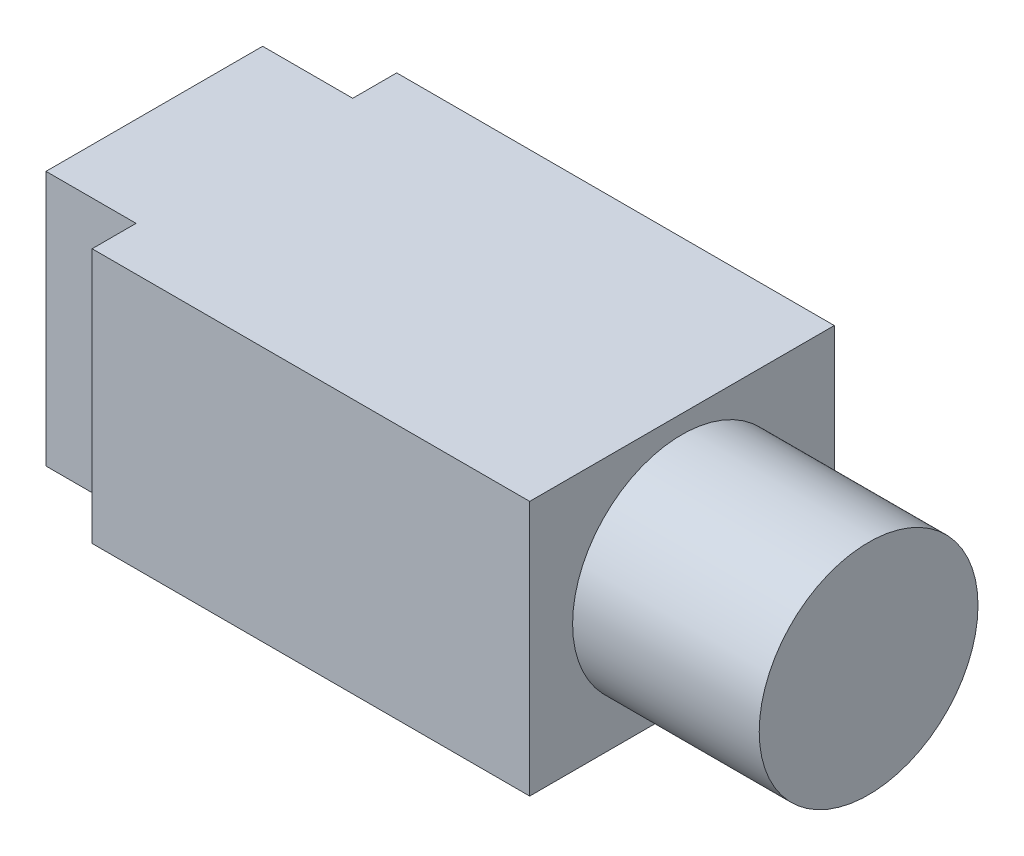
ISO-10303-21;
HEADER;
FILE_DESCRIPTION(('STEP AP214'),'2;1');
FILE_NAME('part.step','',(''),(''),'','','');
FILE_SCHEMA(('AUTOMOTIVE_DESIGN { 1 0 10303 214 1 1 1 1 }'));
ENDSEC;
DATA;
#1=APPLICATION_CONTEXT('core data for automotive mechanical design processes');
#2=APPLICATION_PROTOCOL_DEFINITION('international standard','automotive_design',2000,#1);
#3=PRODUCT_CONTEXT('',#1,'mechanical');
#4=PRODUCT('Part','Part','',(#3));
#5=PRODUCT_RELATED_PRODUCT_CATEGORY('part','',(#4));
#6=PRODUCT_DEFINITION_FORMATION('','',#4);
#7=PRODUCT_DEFINITION_CONTEXT('part definition',#1,'design');
#8=PRODUCT_DEFINITION('design','',#6,#7);
#9=PRODUCT_DEFINITION_SHAPE('','',#8);
#10=(LENGTH_UNIT() NAMED_UNIT(*) SI_UNIT(.MILLI.,.METRE.));
#11=(NAMED_UNIT(*) PLANE_ANGLE_UNIT() SI_UNIT($,.RADIAN.));
#12=(NAMED_UNIT(*) SI_UNIT($,.STERADIAN.) SOLID_ANGLE_UNIT());
#13=UNCERTAINTY_MEASURE_WITH_UNIT(LENGTH_MEASURE(1.E-05),#10,'distance_accuracy_value','');
#14=(GEOMETRIC_REPRESENTATION_CONTEXT(3) GLOBAL_UNCERTAINTY_ASSIGNED_CONTEXT((#13)) GLOBAL_UNIT_ASSIGNED_CONTEXT((#10,
#11,#12)) REPRESENTATION_CONTEXT('',''));
#15=CARTESIAN_POINT('',(0.,0.,0.));
#16=DIRECTION('',(0.,0.,1.));
#17=DIRECTION('',(1.,0.,0.));
#18=AXIS2_PLACEMENT_3D('',#15,#16,#17);
#19=CARTESIAN_POINT('',(0.,5.95,-5.05));
#20=DIRECTION('',(0.,0.,1.));
#21=DIRECTION('',(1.,0.,0.));
#22=AXIS2_PLACEMENT_3D('',#19,#20,#21);
#23=PLANE('',#22);
#24=DIRECTION('',(-1.,0.,0.));
#25=VECTOR('',#24,1.);
#26=CARTESIAN_POINT('',(0.,-5.95,-5.05));
#27=LINE('',#26,#25);
#28=CARTESIAN_POINT('',(-10.2,-5.95,-5.05));
#29=VERTEX_POINT('',#28);
#30=CARTESIAN_POINT('',(-14.4,-5.95,-5.05));
#31=VERTEX_POINT('',#30);
#32=EDGE_CURVE('E151',#29,#31,#27,.T.);
#33=ORIENTED_EDGE('',*,*,#32,.T.);
#34=DIRECTION('',(0.,-1.,0.));
#35=VECTOR('',#34,1.);
#36=CARTESIAN_POINT('',(-14.4,5.95,-5.05));
#37=LINE('',#36,#35);
#38=CARTESIAN_POINT('',(-14.4,5.95,-5.05));
#39=VERTEX_POINT('',#38);
#40=EDGE_CURVE('E48',#39,#31,#37,.T.);
#41=ORIENTED_EDGE('',*,*,#40,.F.);
#42=DIRECTION('',(-1.,0.,0.));
#43=VECTOR('',#42,1.);
#44=CARTESIAN_POINT('',(0.,5.95,-5.05));
#45=LINE('',#44,#43);
#46=CARTESIAN_POINT('',(-10.2,5.95,-5.05));
#47=VERTEX_POINT('',#46);
#48=EDGE_CURVE('E200',#47,#39,#45,.T.);
#49=ORIENTED_EDGE('',*,*,#48,.F.);
#50=DIRECTION('',(0.,-1.,0.));
#51=VECTOR('',#50,1.);
#52=CARTESIAN_POINT('',(-10.2,5.95,-5.05));
#53=LINE('',#52,#51);
#54=EDGE_CURVE('E63',#47,#29,#53,.T.);
#55=ORIENTED_EDGE('',*,*,#54,.T.);
#56=EDGE_LOOP('',(#33,#41,#49,#55));
#57=FACE_BOUND('',#56,.T.);
#58=ADVANCED_FACE('F45',(#57),#23,.F.);
#59=CARTESIAN_POINT('',(-14.4,5.95,0.));
#60=DIRECTION('',(1.,0.,0.));
#61=DIRECTION('',(0.,0.,-1.));
#62=AXIS2_PLACEMENT_3D('',#59,#60,#61);
#63=PLANE('',#62);
#64=DIRECTION('',(0.,0.,1.));
#65=VECTOR('',#64,1.);
#66=CARTESIAN_POINT('',(-14.4,-5.95,0.));
#67=LINE('',#66,#65);
#68=CARTESIAN_POINT('',(-14.4,-5.95,5.05));
#69=VERTEX_POINT('',#68);
#70=EDGE_CURVE('E154',#31,#69,#67,.T.);
#71=ORIENTED_EDGE('',*,*,#70,.T.);
#72=DIRECTION('',(0.,-1.,0.));
#73=VECTOR('',#72,1.);
#74=CARTESIAN_POINT('',(-14.4,5.95,5.05));
#75=LINE('',#74,#73);
#76=CARTESIAN_POINT('',(-14.4,5.95,5.05));
#77=VERTEX_POINT('',#76);
#78=EDGE_CURVE('E187',#77,#69,#75,.T.);
#79=ORIENTED_EDGE('',*,*,#78,.F.);
#80=DIRECTION('',(0.,0.,1.));
#81=VECTOR('',#80,1.);
#82=CARTESIAN_POINT('',(-14.4,5.95,0.));
#83=LINE('',#82,#81);
#84=EDGE_CURVE('E102',#39,#77,#83,.T.);
#85=ORIENTED_EDGE('',*,*,#84,.F.);
#86=ORIENTED_EDGE('',*,*,#40,.T.);
#87=EDGE_LOOP('',(#71,#79,#85,#86));
#88=FACE_BOUND('',#87,.T.);
#89=ADVANCED_FACE('F194',(#88),#63,.F.);
#90=CARTESIAN_POINT('',(0.,5.95,5.05));
#91=DIRECTION('',(0.,0.,1.));
#92=DIRECTION('',(1.,0.,0.));
#93=AXIS2_PLACEMENT_3D('',#90,#91,#92);
#94=PLANE('',#93);
#95=DIRECTION('',(-1.,0.,0.));
#96=VECTOR('',#95,1.);
#97=CARTESIAN_POINT('',(0.,-5.95,5.05));
#98=LINE('',#97,#96);
#99=CARTESIAN_POINT('',(-10.2,-5.95,5.05));
#100=VERTEX_POINT('',#99);
#101=EDGE_CURVE('E159',#100,#69,#98,.T.);
#102=ORIENTED_EDGE('',*,*,#101,.F.);
#103=DIRECTION('',(0.,-1.,0.));
#104=VECTOR('',#103,1.);
#105=CARTESIAN_POINT('',(-10.2,5.95,5.05));
#106=LINE('',#105,#104);
#107=CARTESIAN_POINT('',(-10.2,5.95,5.05));
#108=VERTEX_POINT('',#107);
#109=EDGE_CURVE('E185',#108,#100,#106,.T.);
#110=ORIENTED_EDGE('',*,*,#109,.F.);
#111=DIRECTION('',(-1.,0.,0.));
#112=VECTOR('',#111,1.);
#113=CARTESIAN_POINT('',(0.,5.95,5.05));
#114=LINE('',#113,#112);
#115=EDGE_CURVE('E204',#108,#77,#114,.T.);
#116=ORIENTED_EDGE('',*,*,#115,.T.);
#117=ORIENTED_EDGE('',*,*,#78,.T.);
#118=EDGE_LOOP('',(#102,#110,#116,#117));
#119=FACE_BOUND('',#118,.T.);
#120=ADVANCED_FACE('F216',(#119),#94,.T.);
#121=CARTESIAN_POINT('',(-10.2,5.95,0.));
#122=DIRECTION('',(-1.,0.,0.));
#123=DIRECTION('',(0.,0.,1.));
#124=AXIS2_PLACEMENT_3D('',#121,#122,#123);
#125=PLANE('',#124);
#126=DIRECTION('',(0.,0.,-1.));
#127=VECTOR('',#126,1.);
#128=CARTESIAN_POINT('',(-10.2,-5.95,0.));
#129=LINE('',#128,#127);
#130=CARTESIAN_POINT('',(-10.2,-5.95,7.1));
#131=VERTEX_POINT('',#130);
#132=EDGE_CURVE('E163',#131,#100,#129,.T.);
#133=ORIENTED_EDGE('',*,*,#132,.F.);
#134=DIRECTION('',(0.,-1.,0.));
#135=VECTOR('',#134,1.);
#136=CARTESIAN_POINT('',(-10.2,5.95,7.1));
#137=LINE('',#136,#135);
#138=CARTESIAN_POINT('',(-10.2,5.95,7.1));
#139=VERTEX_POINT('',#138);
#140=EDGE_CURVE('E182',#139,#131,#137,.T.);
#141=ORIENTED_EDGE('',*,*,#140,.F.);
#142=DIRECTION('',(0.,0.,-1.));
#143=VECTOR('',#142,1.);
#144=CARTESIAN_POINT('',(-10.2,5.95,0.));
#145=LINE('',#144,#143);
#146=EDGE_CURVE('E148',#139,#108,#145,.T.);
#147=ORIENTED_EDGE('',*,*,#146,.T.);
#148=ORIENTED_EDGE('',*,*,#109,.T.);
#149=EDGE_LOOP('',(#133,#141,#147,#148));
#150=FACE_BOUND('',#149,.T.);
#151=ADVANCED_FACE('F214',(#150),#125,.T.);
#152=CARTESIAN_POINT('',(0.,5.95,7.1));
#153=DIRECTION('',(0.,0.,-1.));
#154=DIRECTION('',(-1.,0.,0.));
#155=AXIS2_PLACEMENT_3D('',#152,#153,#154);
#156=PLANE('',#155);
#157=DIRECTION('',(1.,0.,0.));
#158=VECTOR('',#157,1.);
#159=CARTESIAN_POINT('',(0.,-5.95,7.1));
#160=LINE('',#159,#158);
#161=CARTESIAN_POINT('',(10.2,-5.95,7.1));
#162=VERTEX_POINT('',#161);
#163=EDGE_CURVE('E167',#131,#162,#160,.T.);
#164=ORIENTED_EDGE('',*,*,#163,.T.);
#165=DIRECTION('',(0.,-1.,0.));
#166=VECTOR('',#165,1.);
#167=CARTESIAN_POINT('',(10.2,5.95,7.1));
#168=LINE('',#167,#166);
#169=CARTESIAN_POINT('',(10.2,5.95,7.1));
#170=VERTEX_POINT('',#169);
#171=EDGE_CURVE('E140',#170,#162,#168,.T.);
#172=ORIENTED_EDGE('',*,*,#171,.F.);
#173=DIRECTION('',(1.,0.,0.));
#174=VECTOR('',#173,1.);
#175=CARTESIAN_POINT('',(0.,5.95,7.1));
#176=LINE('',#175,#174);
#177=EDGE_CURVE('E126',#139,#170,#176,.T.);
#178=ORIENTED_EDGE('',*,*,#177,.F.);
#179=ORIENTED_EDGE('',*,*,#140,.T.);
#180=EDGE_LOOP('',(#164,#172,#178,#179));
#181=FACE_BOUND('',#180,.T.);
#182=ADVANCED_FACE('F219',(#181),#156,.F.);
#183=CARTESIAN_POINT('',(10.2,5.95,0.));
#184=DIRECTION('',(-1.,0.,0.));
#185=DIRECTION('',(0.,0.,1.));
#186=AXIS2_PLACEMENT_3D('',#183,#184,#185);
#187=PLANE('',#186);
#188=CARTESIAN_POINT('',(10.2,0.,0.));
#189=DIRECTION('',(1.,0.,0.));
#190=DIRECTION('',(0.,0.,-1.));
#191=AXIS2_PLACEMENT_3D('',#188,#189,#190);
#192=CIRCLE('',#191,5.1);
#193=CARTESIAN_POINT('',(10.2,0.,-5.1));
#194=VERTEX_POINT('',#193);
#195=EDGE_CURVE('E11',#194,#194,#192,.T.);
#196=ORIENTED_EDGE('',*,*,#195,.F.);
#197=EDGE_LOOP('',(#196));
#198=FACE_BOUND('',#197,.T.);
#199=DIRECTION('',(0.,0.,-1.));
#200=VECTOR('',#199,1.);
#201=CARTESIAN_POINT('',(10.2,-5.95,0.));
#202=LINE('',#201,#200);
#203=CARTESIAN_POINT('',(10.2,-5.95,-7.1));
#204=VERTEX_POINT('',#203);
#205=EDGE_CURVE('E136',#162,#204,#202,.T.);
#206=ORIENTED_EDGE('',*,*,#205,.T.);
#207=DIRECTION('',(0.,-1.,0.));
#208=VECTOR('',#207,1.);
#209=CARTESIAN_POINT('',(10.2,5.95,-7.1));
#210=LINE('',#209,#208);
#211=CARTESIAN_POINT('',(10.2,5.95,-7.1));
#212=VERTEX_POINT('',#211);
#213=EDGE_CURVE('E133',#212,#204,#210,.T.);
#214=ORIENTED_EDGE('',*,*,#213,.F.);
#215=DIRECTION('',(0.,0.,-1.));
#216=VECTOR('',#215,1.);
#217=CARTESIAN_POINT('',(10.2,5.95,0.));
#218=LINE('',#217,#216);
#219=EDGE_CURVE('E118',#170,#212,#218,.T.);
#220=ORIENTED_EDGE('',*,*,#219,.F.);
#221=ORIENTED_EDGE('',*,*,#171,.T.);
#222=EDGE_LOOP('',(#206,#214,#220,#221));
#223=FACE_BOUND('',#222,.T.);
#224=ADVANCED_FACE('F134',(#198,#223),#187,.F.);
#225=CARTESIAN_POINT('',(0.,5.95,-7.1));
#226=DIRECTION('',(0.,0.,-1.));
#227=DIRECTION('',(-1.,0.,0.));
#228=AXIS2_PLACEMENT_3D('',#225,#226,#227);
#229=PLANE('',#228);
#230=DIRECTION('',(1.,0.,0.));
#231=VECTOR('',#230,1.);
#232=CARTESIAN_POINT('',(0.,-5.95,-7.1));
#233=LINE('',#232,#231);
#234=CARTESIAN_POINT('',(-10.2,-5.95,-7.1));
#235=VERTEX_POINT('',#234);
#236=EDGE_CURVE('E173',#235,#204,#233,.T.);
#237=ORIENTED_EDGE('',*,*,#236,.F.);
#238=DIRECTION('',(0.,-1.,0.));
#239=VECTOR('',#238,1.);
#240=CARTESIAN_POINT('',(-10.2,5.95,-7.1));
#241=LINE('',#240,#239);
#242=CARTESIAN_POINT('',(-10.2,5.95,-7.1));
#243=VERTEX_POINT('',#242);
#244=EDGE_CURVE('E89',#243,#235,#241,.T.);
#245=ORIENTED_EDGE('',*,*,#244,.F.);
#246=DIRECTION('',(1.,0.,0.));
#247=VECTOR('',#246,1.);
#248=CARTESIAN_POINT('',(0.,5.95,-7.1));
#249=LINE('',#248,#247);
#250=EDGE_CURVE('E123',#243,#212,#249,.T.);
#251=ORIENTED_EDGE('',*,*,#250,.T.);
#252=ORIENTED_EDGE('',*,*,#213,.T.);
#253=EDGE_LOOP('',(#237,#245,#251,#252));
#254=FACE_BOUND('',#253,.T.);
#255=ADVANCED_FACE('F142',(#254),#229,.T.);
#256=EDGE_CURVE('E168',#29,#235,#129,.T.);
#257=ORIENTED_EDGE('',*,*,#256,.F.);
#258=ORIENTED_EDGE('',*,*,#54,.F.);
#259=EDGE_CURVE('E144',#47,#243,#145,.T.);
#260=ORIENTED_EDGE('',*,*,#259,.T.);
#261=ORIENTED_EDGE('',*,*,#244,.T.);
#262=EDGE_LOOP('',(#257,#258,#260,#261));
#263=FACE_BOUND('',#262,.T.);
#264=ADVANCED_FACE('F198',(#263),#125,.T.);
#265=CARTESIAN_POINT('',(0.,5.95,0.));
#266=DIRECTION('',(0.,1.,0.));
#267=DIRECTION('',(0.,0.,1.));
#268=AXIS2_PLACEMENT_3D('',#265,#266,#267);
#269=PLANE('',#268);
#270=ORIENTED_EDGE('',*,*,#48,.T.);
#271=ORIENTED_EDGE('',*,*,#84,.T.);
#272=ORIENTED_EDGE('',*,*,#115,.F.);
#273=ORIENTED_EDGE('',*,*,#146,.F.);
#274=ORIENTED_EDGE('',*,*,#177,.T.);
#275=ORIENTED_EDGE('',*,*,#219,.T.);
#276=ORIENTED_EDGE('',*,*,#250,.F.);
#277=ORIENTED_EDGE('',*,*,#259,.F.);
#278=EDGE_LOOP('',(#270,#271,#272,#273,#274,#275,#276,#277));
#279=FACE_BOUND('',#278,.T.);
#280=ADVANCED_FACE('F120',(#279),#269,.T.);
#281=CARTESIAN_POINT('',(0.,-5.95,0.));
#282=DIRECTION('',(0.,1.,0.));
#283=DIRECTION('',(0.,0.,1.));
#284=AXIS2_PLACEMENT_3D('',#281,#282,#283);
#285=PLANE('',#284);
#286=ORIENTED_EDGE('',*,*,#32,.F.);
#287=ORIENTED_EDGE('',*,*,#256,.T.);
#288=ORIENTED_EDGE('',*,*,#236,.T.);
#289=ORIENTED_EDGE('',*,*,#205,.F.);
#290=ORIENTED_EDGE('',*,*,#163,.F.);
#291=ORIENTED_EDGE('',*,*,#132,.T.);
#292=ORIENTED_EDGE('',*,*,#101,.T.);
#293=ORIENTED_EDGE('',*,*,#70,.F.);
#294=EDGE_LOOP('',(#286,#287,#288,#289,#290,#291,#292,#293));
#295=FACE_BOUND('',#294,.T.);
#296=ADVANCED_FACE('F197',(#295),#285,.F.);
#297=CARTESIAN_POINT('',(18.9,0.,0.));
#298=DIRECTION('',(-1.,0.,0.));
#299=DIRECTION('',(0.,0.,1.));
#300=AXIS2_PLACEMENT_3D('',#297,#298,#299);
#301=CYLINDRICAL_SURFACE('',#300,5.1);
#302=CARTESIAN_POINT('',(18.9,0.,0.));
#303=DIRECTION('',(1.,0.,0.));
#304=DIRECTION('',(0.,0.,-1.));
#305=AXIS2_PLACEMENT_3D('',#302,#303,#304);
#306=CIRCLE('',#305,5.1);
#307=CARTESIAN_POINT('',(18.9,0.,-5.1));
#308=VERTEX_POINT('',#307);
#309=EDGE_CURVE('E155',#308,#308,#306,.T.);
#310=ORIENTED_EDGE('',*,*,#309,.F.);
#311=EDGE_LOOP('',(#310));
#312=FACE_BOUND('',#311,.T.);
#313=ORIENTED_EDGE('',*,*,#195,.T.);
#314=EDGE_LOOP('',(#313));
#315=FACE_BOUND('',#314,.T.);
#316=ADVANCED_FACE('F286',(#312,#315),#301,.T.);
#317=CARTESIAN_POINT('',(18.9,0.,0.));
#318=DIRECTION('',(1.,0.,0.));
#319=DIRECTION('',(0.,0.,-1.));
#320=AXIS2_PLACEMENT_3D('',#317,#318,#319);
#321=PLANE('',#320);
#322=ORIENTED_EDGE('',*,*,#309,.T.);
#323=EDGE_LOOP('',(#322));
#324=FACE_BOUND('',#323,.T.);
#325=ADVANCED_FACE('F301',(#324),#321,.T.);
#326=CLOSED_SHELL('',(#58,#89,#120,#151,#182,#224,#255,#264,#280,#296,#316,#325));
#327=MANIFOLD_SOLID_BREP('B2',#326);
#328=ADVANCED_BREP_SHAPE_REPRESENTATION('',(#18,#327),#14);
#329=SHAPE_DEFINITION_REPRESENTATION(#9,#328);
ENDSEC;
END-ISO-10303-21;
